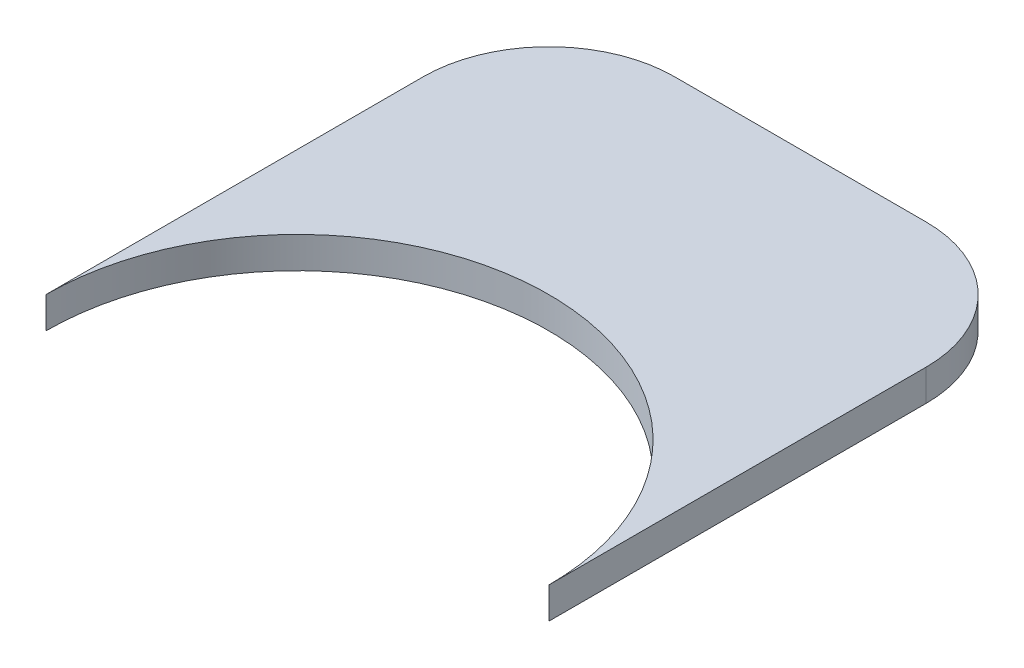
ISO-10303-21;
HEADER;
FILE_DESCRIPTION(('STEP AP214'),'2;1');
FILE_NAME('part.step','',(''),(''),'','','');
FILE_SCHEMA(('AUTOMOTIVE_DESIGN { 1 0 10303 214 1 1 1 1 }'));
ENDSEC;
DATA;
#1=APPLICATION_CONTEXT('core data for automotive mechanical design processes');
#2=APPLICATION_PROTOCOL_DEFINITION('international standard','automotive_design',2000,#1);
#3=PRODUCT_CONTEXT('',#1,'mechanical');
#4=PRODUCT('Part','Part','',(#3));
#5=PRODUCT_RELATED_PRODUCT_CATEGORY('part','',(#4));
#6=PRODUCT_DEFINITION_FORMATION('','',#4);
#7=PRODUCT_DEFINITION_CONTEXT('part definition',#1,'design');
#8=PRODUCT_DEFINITION('design','',#6,#7);
#9=PRODUCT_DEFINITION_SHAPE('','',#8);
#10=(LENGTH_UNIT() NAMED_UNIT(*) SI_UNIT(.MILLI.,.METRE.));
#11=(NAMED_UNIT(*) PLANE_ANGLE_UNIT() SI_UNIT($,.RADIAN.));
#12=(NAMED_UNIT(*) SI_UNIT($,.STERADIAN.) SOLID_ANGLE_UNIT());
#13=UNCERTAINTY_MEASURE_WITH_UNIT(LENGTH_MEASURE(1.E-05),#10,'distance_accuracy_value','');
#14=(GEOMETRIC_REPRESENTATION_CONTEXT(3) GLOBAL_UNCERTAINTY_ASSIGNED_CONTEXT((#13)) GLOBAL_UNIT_ASSIGNED_CONTEXT((#10,
#11,#12)) REPRESENTATION_CONTEXT('',''));
#15=CARTESIAN_POINT('',(0.,0.,0.));
#16=DIRECTION('',(0.,0.,1.));
#17=DIRECTION('',(1.,0.,0.));
#18=AXIS2_PLACEMENT_3D('',#15,#16,#17);
#19=CARTESIAN_POINT('',(0.,1.5875,9.525));
#20=DIRECTION('',(0.,-1.,0.));
#21=DIRECTION('',(0.,0.,-1.));
#22=AXIS2_PLACEMENT_3D('',#19,#20,#21);
#23=CYLINDRICAL_SURFACE('',#22,12.7);
#24=CARTESIAN_POINT('',(0.,0.,9.525));
#25=DIRECTION('',(0.,-1.,0.));
#26=DIRECTION('',(0.,0.,1.));
#27=AXIS2_PLACEMENT_3D('',#24,#25,#26);
#28=CIRCLE('',#27,12.7);
#29=CARTESIAN_POINT('',(-12.7,0.,9.525));
#30=VERTEX_POINT('',#29);
#31=CARTESIAN_POINT('',(12.7,0.,9.525));
#32=VERTEX_POINT('',#31);
#33=EDGE_CURVE('E123',#30,#32,#28,.T.);
#34=ORIENTED_EDGE('',*,*,#33,.T.);
#35=DIRECTION('',(0.,-1.,0.));
#36=VECTOR('',#35,1.);
#37=CARTESIAN_POINT('',(12.7,1.5875,9.525));
#38=LINE('',#37,#36);
#39=CARTESIAN_POINT('',(12.7,1.5875,9.525));
#40=VERTEX_POINT('',#39);
#41=EDGE_CURVE('E11',#40,#32,#38,.T.);
#42=ORIENTED_EDGE('',*,*,#41,.F.);
#43=CARTESIAN_POINT('',(0.,1.5875,9.525));
#44=DIRECTION('',(0.,-1.,0.));
#45=DIRECTION('',(0.,0.,1.));
#46=AXIS2_PLACEMENT_3D('',#43,#44,#45);
#47=CIRCLE('',#46,12.7);
#48=CARTESIAN_POINT('',(-12.7,1.5875,9.525));
#49=VERTEX_POINT('',#48);
#50=EDGE_CURVE('E133',#49,#40,#47,.T.);
#51=ORIENTED_EDGE('',*,*,#50,.F.);
#52=DIRECTION('',(0.,-1.,0.));
#53=VECTOR('',#52,1.);
#54=CARTESIAN_POINT('',(-12.7,1.5875,9.525));
#55=LINE('',#54,#53);
#56=EDGE_CURVE('E119',#49,#30,#55,.T.);
#57=ORIENTED_EDGE('',*,*,#56,.T.);
#58=EDGE_LOOP('',(#34,#42,#51,#57));
#59=FACE_BOUND('',#58,.T.);
#60=ADVANCED_FACE('F39',(#59),#23,.F.);
#61=CARTESIAN_POINT('',(12.7,1.5875,9.525));
#62=DIRECTION('',(-1.,0.,0.));
#63=DIRECTION('',(0.,0.,1.));
#64=AXIS2_PLACEMENT_3D('',#61,#62,#63);
#65=PLANE('',#64);
#66=DIRECTION('',(0.,0.,-1.));
#67=VECTOR('',#66,1.);
#68=CARTESIAN_POINT('',(12.7,0.,9.525));
#69=LINE('',#68,#67);
#70=CARTESIAN_POINT('',(12.7,0.,-9.525));
#71=VERTEX_POINT('',#70);
#72=EDGE_CURVE('E126',#32,#71,#69,.T.);
#73=ORIENTED_EDGE('',*,*,#72,.T.);
#74=DIRECTION('',(0.,-1.,0.));
#75=VECTOR('',#74,1.);
#76=CARTESIAN_POINT('',(12.7,1.5875,-9.525));
#77=LINE('',#76,#75);
#78=CARTESIAN_POINT('',(12.7,1.5875,-9.525));
#79=VERTEX_POINT('',#78);
#80=EDGE_CURVE('E47',#79,#71,#77,.T.);
#81=ORIENTED_EDGE('',*,*,#80,.F.);
#82=DIRECTION('',(0.,0.,-1.));
#83=VECTOR('',#82,1.);
#84=CARTESIAN_POINT('',(12.7,1.5875,9.525));
#85=LINE('',#84,#83);
#86=EDGE_CURVE('E92',#40,#79,#85,.T.);
#87=ORIENTED_EDGE('',*,*,#86,.F.);
#88=ORIENTED_EDGE('',*,*,#41,.T.);
#89=EDGE_LOOP('',(#73,#81,#87,#88));
#90=FACE_BOUND('',#89,.T.);
#91=ADVANCED_FACE('F157',(#90),#65,.F.);
#92=CARTESIAN_POINT('',(6.35,1.5875,-9.525));
#93=DIRECTION('',(0.,-1.,0.));
#94=DIRECTION('',(0.,0.,-1.));
#95=AXIS2_PLACEMENT_3D('',#92,#93,#94);
#96=CYLINDRICAL_SURFACE('',#95,6.35);
#97=CARTESIAN_POINT('',(6.35,0.,-9.525));
#98=DIRECTION('',(0.,1.,0.));
#99=DIRECTION('',(0.,0.,-1.));
#100=AXIS2_PLACEMENT_3D('',#97,#98,#99);
#101=CIRCLE('',#100,6.35);
#102=CARTESIAN_POINT('',(6.35,0.,-15.875));
#103=VERTEX_POINT('',#102);
#104=EDGE_CURVE('E128',#71,#103,#101,.T.);
#105=ORIENTED_EDGE('',*,*,#104,.T.);
#106=DIRECTION('',(0.,-1.,0.));
#107=VECTOR('',#106,1.);
#108=CARTESIAN_POINT('',(6.35,1.5875,-15.875));
#109=LINE('',#108,#107);
#110=CARTESIAN_POINT('',(6.35,1.5875,-15.875));
#111=VERTEX_POINT('',#110);
#112=EDGE_CURVE('E114',#111,#103,#109,.T.);
#113=ORIENTED_EDGE('',*,*,#112,.F.);
#114=CARTESIAN_POINT('',(6.35,1.5875,-9.525));
#115=DIRECTION('',(0.,1.,0.));
#116=DIRECTION('',(0.,0.,-1.));
#117=AXIS2_PLACEMENT_3D('',#114,#115,#116);
#118=CIRCLE('',#117,6.35);
#119=EDGE_CURVE('E105',#79,#111,#118,.T.);
#120=ORIENTED_EDGE('',*,*,#119,.F.);
#121=ORIENTED_EDGE('',*,*,#80,.T.);
#122=EDGE_LOOP('',(#105,#113,#120,#121));
#123=FACE_BOUND('',#122,.T.);
#124=ADVANCED_FACE('F139',(#123),#96,.T.);
#125=CARTESIAN_POINT('',(-6.35,1.5875,-15.875));
#126=DIRECTION('',(0.,0.,1.));
#127=DIRECTION('',(1.,0.,0.));
#128=AXIS2_PLACEMENT_3D('',#125,#126,#127);
#129=PLANE('',#128);
#130=DIRECTION('',(-1.,0.,0.));
#131=VECTOR('',#130,1.);
#132=CARTESIAN_POINT('',(-6.35,0.,-15.875));
#133=LINE('',#132,#131);
#134=CARTESIAN_POINT('',(-6.35,0.,-15.875));
#135=VERTEX_POINT('',#134);
#136=EDGE_CURVE('E113',#103,#135,#133,.T.);
#137=ORIENTED_EDGE('',*,*,#136,.T.);
#138=DIRECTION('',(0.,-1.,0.));
#139=VECTOR('',#138,1.);
#140=CARTESIAN_POINT('',(-6.35,1.5875,-15.875));
#141=LINE('',#140,#139);
#142=CARTESIAN_POINT('',(-6.35,1.5875,-15.875));
#143=VERTEX_POINT('',#142);
#144=EDGE_CURVE('E110',#143,#135,#141,.T.);
#145=ORIENTED_EDGE('',*,*,#144,.F.);
#146=DIRECTION('',(-1.,0.,0.));
#147=VECTOR('',#146,1.);
#148=CARTESIAN_POINT('',(-6.35,1.5875,-15.875));
#149=LINE('',#148,#147);
#150=EDGE_CURVE('E99',#111,#143,#149,.T.);
#151=ORIENTED_EDGE('',*,*,#150,.F.);
#152=ORIENTED_EDGE('',*,*,#112,.T.);
#153=EDGE_LOOP('',(#137,#145,#151,#152));
#154=FACE_BOUND('',#153,.T.);
#155=ADVANCED_FACE('F111',(#154),#129,.F.);
#156=CARTESIAN_POINT('',(-6.35,1.5875,-9.525));
#157=DIRECTION('',(0.,-1.,0.));
#158=DIRECTION('',(0.,0.,-1.));
#159=AXIS2_PLACEMENT_3D('',#156,#157,#158);
#160=CYLINDRICAL_SURFACE('',#159,6.35);
#161=CARTESIAN_POINT('',(-6.35,0.,-9.525));
#162=DIRECTION('',(0.,1.,0.));
#163=DIRECTION('',(0.,0.,-1.));
#164=AXIS2_PLACEMENT_3D('',#161,#162,#163);
#165=CIRCLE('',#164,6.35);
#166=CARTESIAN_POINT('',(-12.7,0.,-9.525));
#167=VERTEX_POINT('',#166);
#168=EDGE_CURVE('E78',#135,#167,#165,.T.);
#169=ORIENTED_EDGE('',*,*,#168,.T.);
#170=DIRECTION('',(0.,-1.,0.));
#171=VECTOR('',#170,1.);
#172=CARTESIAN_POINT('',(-12.7,1.5875,-9.525));
#173=LINE('',#172,#171);
#174=CARTESIAN_POINT('',(-12.7,1.5875,-9.525));
#175=VERTEX_POINT('',#174);
#176=EDGE_CURVE('E115',#175,#167,#173,.T.);
#177=ORIENTED_EDGE('',*,*,#176,.F.);
#178=CARTESIAN_POINT('',(-6.35,1.5875,-9.525));
#179=DIRECTION('',(0.,1.,0.));
#180=DIRECTION('',(0.,0.,-1.));
#181=AXIS2_PLACEMENT_3D('',#178,#179,#180);
#182=CIRCLE('',#181,6.35);
#183=EDGE_CURVE('E103',#143,#175,#182,.T.);
#184=ORIENTED_EDGE('',*,*,#183,.F.);
#185=ORIENTED_EDGE('',*,*,#144,.T.);
#186=EDGE_LOOP('',(#169,#177,#184,#185));
#187=FACE_BOUND('',#186,.T.);
#188=ADVANCED_FACE('F117',(#187),#160,.T.);
#189=CARTESIAN_POINT('',(-12.7,1.5875,9.525));
#190=DIRECTION('',(1.,0.,0.));
#191=DIRECTION('',(0.,0.,-1.));
#192=AXIS2_PLACEMENT_3D('',#189,#190,#191);
#193=PLANE('',#192);
#194=DIRECTION('',(0.,0.,1.));
#195=VECTOR('',#194,1.);
#196=CARTESIAN_POINT('',(-12.7,0.,9.525));
#197=LINE('',#196,#195);
#198=EDGE_CURVE('E84',#167,#30,#197,.T.);
#199=ORIENTED_EDGE('',*,*,#198,.T.);
#200=ORIENTED_EDGE('',*,*,#56,.F.);
#201=DIRECTION('',(0.,0.,1.));
#202=VECTOR('',#201,1.);
#203=CARTESIAN_POINT('',(-12.7,1.5875,9.525));
#204=LINE('',#203,#202);
#205=EDGE_CURVE('E55',#175,#49,#204,.T.);
#206=ORIENTED_EDGE('',*,*,#205,.F.);
#207=ORIENTED_EDGE('',*,*,#176,.T.);
#208=EDGE_LOOP('',(#199,#200,#206,#207));
#209=FACE_BOUND('',#208,.T.);
#210=ADVANCED_FACE('F146',(#209),#193,.F.);
#211=CARTESIAN_POINT('',(0.,1.5875,9.525));
#212=DIRECTION('',(0.,1.,0.));
#213=DIRECTION('',(0.,0.,1.));
#214=AXIS2_PLACEMENT_3D('',#211,#212,#213);
#215=PLANE('',#214);
#216=ORIENTED_EDGE('',*,*,#50,.T.);
#217=ORIENTED_EDGE('',*,*,#86,.T.);
#218=ORIENTED_EDGE('',*,*,#119,.T.);
#219=ORIENTED_EDGE('',*,*,#150,.T.);
#220=ORIENTED_EDGE('',*,*,#183,.T.);
#221=ORIENTED_EDGE('',*,*,#205,.T.);
#222=EDGE_LOOP('',(#216,#217,#218,#219,#220,#221));
#223=FACE_BOUND('',#222,.T.);
#224=ADVANCED_FACE('F101',(#223),#215,.T.);
#225=CARTESIAN_POINT('',(0.,0.,9.525));
#226=DIRECTION('',(0.,1.,0.));
#227=DIRECTION('',(0.,0.,1.));
#228=AXIS2_PLACEMENT_3D('',#225,#226,#227);
#229=PLANE('',#228);
#230=ORIENTED_EDGE('',*,*,#33,.F.);
#231=ORIENTED_EDGE('',*,*,#198,.F.);
#232=ORIENTED_EDGE('',*,*,#168,.F.);
#233=ORIENTED_EDGE('',*,*,#136,.F.);
#234=ORIENTED_EDGE('',*,*,#104,.F.);
#235=ORIENTED_EDGE('',*,*,#72,.F.);
#236=EDGE_LOOP('',(#230,#231,#232,#233,#234,#235));
#237=FACE_BOUND('',#236,.T.);
#238=ADVANCED_FACE('F142',(#237),#229,.F.);
#239=CLOSED_SHELL('',(#60,#91,#124,#155,#188,#210,#224,#238));
#240=MANIFOLD_SOLID_BREP('B2',#239);
#241=ADVANCED_BREP_SHAPE_REPRESENTATION('',(#18,#240),#14);
#242=SHAPE_DEFINITION_REPRESENTATION(#9,#241);
ENDSEC;
END-ISO-10303-21;
